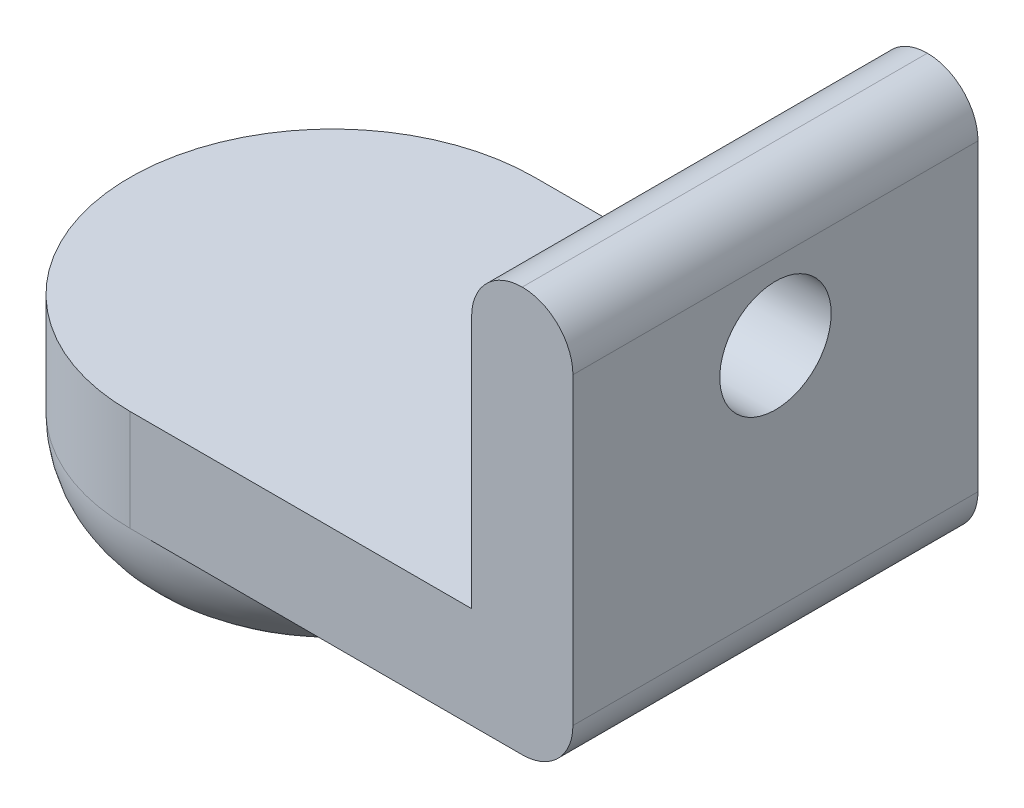
ISO-10303-21;
HEADER;
FILE_DESCRIPTION(('STEP AP214'),'2;1');
FILE_NAME('part.step','',(''),(''),'','','');
FILE_SCHEMA(('AUTOMOTIVE_DESIGN { 1 0 10303 214 1 1 1 1 }'));
ENDSEC;
DATA;
#1=APPLICATION_CONTEXT('core data for automotive mechanical design processes');
#2=APPLICATION_PROTOCOL_DEFINITION('international standard','automotive_design',2000,#1);
#3=PRODUCT_CONTEXT('',#1,'mechanical');
#4=PRODUCT('Part','Part','',(#3));
#5=PRODUCT_RELATED_PRODUCT_CATEGORY('part','',(#4));
#6=PRODUCT_DEFINITION_FORMATION('','',#4);
#7=PRODUCT_DEFINITION_CONTEXT('part definition',#1,'design');
#8=PRODUCT_DEFINITION('design','',#6,#7);
#9=PRODUCT_DEFINITION_SHAPE('','',#8);
#10=(LENGTH_UNIT() NAMED_UNIT(*) SI_UNIT(.MILLI.,.METRE.));
#11=(NAMED_UNIT(*) PLANE_ANGLE_UNIT() SI_UNIT($,.RADIAN.));
#12=(NAMED_UNIT(*) SI_UNIT($,.STERADIAN.) SOLID_ANGLE_UNIT());
#13=UNCERTAINTY_MEASURE_WITH_UNIT(LENGTH_MEASURE(1.E-05),#10,'distance_accuracy_value','');
#14=(GEOMETRIC_REPRESENTATION_CONTEXT(3) GLOBAL_UNCERTAINTY_ASSIGNED_CONTEXT((#13)) GLOBAL_UNIT_ASSIGNED_CONTEXT((#10,
#11,#12)) REPRESENTATION_CONTEXT('',''));
#15=CARTESIAN_POINT('',(0.,0.,0.));
#16=DIRECTION('',(0.,0.,1.));
#17=DIRECTION('',(1.,0.,0.));
#18=AXIS2_PLACEMENT_3D('',#15,#16,#17);
#19=CARTESIAN_POINT('',(0.,2.,0.));
#20=DIRECTION('',(0.,1.,0.));
#21=DIRECTION('',(0.,0.,1.));
#22=AXIS2_PLACEMENT_3D('',#19,#20,#21);
#23=PLANE('',#22);
#24=DIRECTION('',(0.,0.,1.));
#25=VECTOR('',#24,1.);
#26=CARTESIAN_POINT('',(6.74999999999999,2.,-4.));
#27=LINE('',#26,#25);
#28=CARTESIAN_POINT('',(6.74999999999999,2.,-4.));
#29=VERTEX_POINT('',#28);
#30=CARTESIAN_POINT('',(6.74999999999999,2.,4.));
#31=VERTEX_POINT('',#30);
#32=EDGE_CURVE('E110',#29,#31,#27,.T.);
#33=ORIENTED_EDGE('',*,*,#32,.F.);
#34=DIRECTION('',(-1.,0.,0.));
#35=VECTOR('',#34,1.);
#36=CARTESIAN_POINT('',(0.,2.,-4.));
#37=LINE('',#36,#35);
#38=CARTESIAN_POINT('',(0.,2.,-4.));
#39=VERTEX_POINT('',#38);
#40=EDGE_CURVE('E118',#29,#39,#37,.T.);
#41=ORIENTED_EDGE('',*,*,#40,.T.);
#42=CARTESIAN_POINT('',(0.,2.,0.));
#43=DIRECTION('',(0.,1.,0.));
#44=DIRECTION('',(0.,0.,1.));
#45=AXIS2_PLACEMENT_3D('',#42,#43,#44);
#46=CIRCLE('',#45,4.);
#47=CARTESIAN_POINT('',(0.,2.,4.));
#48=VERTEX_POINT('',#47);
#49=EDGE_CURVE('E116',#39,#48,#46,.T.);
#50=ORIENTED_EDGE('',*,*,#49,.T.);
#51=DIRECTION('',(1.,0.,0.));
#52=VECTOR('',#51,1.);
#53=CARTESIAN_POINT('',(0.,2.,4.));
#54=LINE('',#53,#52);
#55=EDGE_CURVE('E101',#48,#31,#54,.T.);
#56=ORIENTED_EDGE('',*,*,#55,.T.);
#57=EDGE_LOOP('',(#33,#41,#50,#56));
#58=FACE_BOUND('',#57,.T.);
#59=ADVANCED_FACE('F34',(#58),#23,.T.);
#60=CARTESIAN_POINT('',(0.,0.,0.));
#61=DIRECTION('',(0.,1.,0.));
#62=DIRECTION('',(0.,0.,1.));
#63=AXIS2_PLACEMENT_3D('',#60,#61,#62);
#64=PLANE('',#63);
#65=DIRECTION('',(-1.,0.,0.));
#66=VECTOR('',#65,1.);
#67=CARTESIAN_POINT('',(0.,0.,-4.));
#68=LINE('',#67,#66);
#69=CARTESIAN_POINT('',(7.74999999999999,0.,-4.));
#70=VERTEX_POINT('',#69);
#71=CARTESIAN_POINT('',(0.,0.,-4.));
#72=VERTEX_POINT('',#71);
#73=EDGE_CURVE('E136',#70,#72,#68,.T.);
#74=ORIENTED_EDGE('',*,*,#73,.F.);
#75=DIRECTION('',(0.,0.,-1.));
#76=VECTOR('',#75,1.);
#77=CARTESIAN_POINT('',(7.74999999999999,0.,4.));
#78=LINE('',#77,#76);
#79=CARTESIAN_POINT('',(7.74999999999999,0.,4.));
#80=VERTEX_POINT('',#79);
#81=EDGE_CURVE('E157',#70,#80,#78,.F.);
#82=ORIENTED_EDGE('',*,*,#81,.T.);
#83=DIRECTION('',(1.,0.,0.));
#84=VECTOR('',#83,1.);
#85=CARTESIAN_POINT('',(0.,0.,4.));
#86=LINE('',#85,#84);
#87=CARTESIAN_POINT('',(0.,0.,4.));
#88=VERTEX_POINT('',#87);
#89=EDGE_CURVE('E135',#88,#80,#86,.T.);
#90=ORIENTED_EDGE('',*,*,#89,.F.);
#91=CARTESIAN_POINT('',(0.,0.,0.));
#92=DIRECTION('',(0.,1.,0.));
#93=DIRECTION('',(0.,0.,1.));
#94=AXIS2_PLACEMENT_3D('',#91,#92,#93);
#95=CIRCLE('',#94,4.);
#96=EDGE_CURVE('E132',#88,#72,#95,.T.);
#97=ORIENTED_EDGE('',*,*,#96,.T.);
#98=EDGE_LOOP('',(#74,#82,#90,#97));
#99=FACE_BOUND('',#98,.T.);
#100=ADVANCED_FACE('F181',(#99),#64,.F.);
#101=CARTESIAN_POINT('',(0.,2.,4.));
#102=DIRECTION('',(0.,0.,-1.));
#103=DIRECTION('',(-1.,0.,0.));
#104=AXIS2_PLACEMENT_3D('',#101,#102,#103);
#105=PLANE('',#104);
#106=CARTESIAN_POINT('',(7.74999999999999,7.,4.));
#107=DIRECTION('',(0.,0.,-1.));
#108=DIRECTION('',(-1.,0.,0.));
#109=AXIS2_PLACEMENT_3D('',#106,#107,#108);
#110=CIRCLE('',#109,1.);
#111=CARTESIAN_POINT('',(8.74999999999999,7.,4.));
#112=VERTEX_POINT('',#111);
#113=CARTESIAN_POINT('',(7.74999999999999,8.,4.));
#114=VERTEX_POINT('',#113);
#115=EDGE_CURVE('E162',#112,#114,#110,.F.);
#116=ORIENTED_EDGE('',*,*,#115,.T.);
#117=CARTESIAN_POINT('',(7.74999999999999,7.,4.));
#118=DIRECTION('',(0.,0.,-1.));
#119=DIRECTION('',(-1.,0.,0.));
#120=AXIS2_PLACEMENT_3D('',#117,#118,#119);
#121=CIRCLE('',#120,1.);
#122=CARTESIAN_POINT('',(6.74999999999999,7.,4.));
#123=VERTEX_POINT('',#122);
#124=EDGE_CURVE('E104',#114,#123,#121,.F.);
#125=ORIENTED_EDGE('',*,*,#124,.T.);
#126=DIRECTION('',(0.,-1.,0.));
#127=VECTOR('',#126,1.);
#128=CARTESIAN_POINT('',(6.74999999999999,8.,4.));
#129=LINE('',#128,#127);
#130=EDGE_CURVE('E97',#123,#31,#129,.T.);
#131=ORIENTED_EDGE('',*,*,#130,.T.);
#132=ORIENTED_EDGE('',*,*,#55,.F.);
#133=DIRECTION('',(0.,-1.,0.));
#134=VECTOR('',#133,1.);
#135=CARTESIAN_POINT('',(0.,2.,4.));
#136=LINE('',#135,#134);
#137=EDGE_CURVE('E145',#48,#88,#136,.T.);
#138=ORIENTED_EDGE('',*,*,#137,.T.);
#139=ORIENTED_EDGE('',*,*,#89,.T.);
#140=CARTESIAN_POINT('',(7.74999999999999,1.,4.));
#141=DIRECTION('',(0.,0.,-1.));
#142=DIRECTION('',(-1.,0.,0.));
#143=AXIS2_PLACEMENT_3D('',#140,#141,#142);
#144=CIRCLE('',#143,1.);
#145=CARTESIAN_POINT('',(8.74999999999999,1.,4.));
#146=VERTEX_POINT('',#145);
#147=EDGE_CURVE('E159',#80,#146,#144,.F.);
#148=ORIENTED_EDGE('',*,*,#147,.T.);
#149=DIRECTION('',(0.,-1.,0.));
#150=VECTOR('',#149,1.);
#151=CARTESIAN_POINT('',(8.74999999999999,5.5,4.));
#152=LINE('',#151,#150);
#153=EDGE_CURVE('E128',#112,#146,#152,.T.);
#154=ORIENTED_EDGE('',*,*,#153,.F.);
#155=EDGE_LOOP('',(#116,#125,#131,#132,#138,#139,#148,#154));
#156=FACE_BOUND('',#155,.T.);
#157=ADVANCED_FACE('F99',(#156),#105,.F.);
#158=CARTESIAN_POINT('',(0.,2.,-4.));
#159=DIRECTION('',(0.,0.,1.));
#160=DIRECTION('',(1.,0.,0.));
#161=AXIS2_PLACEMENT_3D('',#158,#159,#160);
#162=PLANE('',#161);
#163=DIRECTION('',(0.,-1.,0.));
#164=VECTOR('',#163,1.);
#165=CARTESIAN_POINT('',(6.74999999999999,8.,-4.));
#166=LINE('',#165,#164);
#167=CARTESIAN_POINT('',(6.74999999999999,7.,-4.));
#168=VERTEX_POINT('',#167);
#169=EDGE_CURVE('E109',#168,#29,#166,.T.);
#170=ORIENTED_EDGE('',*,*,#169,.F.);
#171=CARTESIAN_POINT('',(7.74999999999999,7.,-4.));
#172=DIRECTION('',(0.,0.,1.));
#173=DIRECTION('',(1.,0.,0.));
#174=AXIS2_PLACEMENT_3D('',#171,#172,#173);
#175=CIRCLE('',#174,1.);
#176=CARTESIAN_POINT('',(7.74999999999999,8.,-4.));
#177=VERTEX_POINT('',#176);
#178=EDGE_CURVE('E43',#168,#177,#175,.F.);
#179=ORIENTED_EDGE('',*,*,#178,.T.);
#180=CARTESIAN_POINT('',(7.74999999999999,7.,-4.));
#181=DIRECTION('',(0.,0.,1.));
#182=DIRECTION('',(1.,0.,0.));
#183=AXIS2_PLACEMENT_3D('',#180,#181,#182);
#184=CIRCLE('',#183,1.);
#185=CARTESIAN_POINT('',(8.74999999999999,7.,-4.));
#186=VERTEX_POINT('',#185);
#187=EDGE_CURVE('E54',#177,#186,#184,.F.);
#188=ORIENTED_EDGE('',*,*,#187,.T.);
#189=DIRECTION('',(0.,1.,0.));
#190=VECTOR('',#189,1.);
#191=CARTESIAN_POINT('',(8.74999999999999,0.,-4.));
#192=LINE('',#191,#190);
#193=CARTESIAN_POINT('',(8.74999999999999,1.,-4.));
#194=VERTEX_POINT('',#193);
#195=EDGE_CURVE('E130',#194,#186,#192,.T.);
#196=ORIENTED_EDGE('',*,*,#195,.F.);
#197=CARTESIAN_POINT('',(7.74999999999999,1.,-4.));
#198=DIRECTION('',(0.,0.,1.));
#199=DIRECTION('',(1.,0.,0.));
#200=AXIS2_PLACEMENT_3D('',#197,#198,#199);
#201=CIRCLE('',#200,1.);
#202=EDGE_CURVE('E155',#194,#70,#201,.F.);
#203=ORIENTED_EDGE('',*,*,#202,.T.);
#204=ORIENTED_EDGE('',*,*,#73,.T.);
#205=DIRECTION('',(0.,-1.,0.));
#206=VECTOR('',#205,1.);
#207=CARTESIAN_POINT('',(0.,2.,-4.));
#208=LINE('',#207,#206);
#209=EDGE_CURVE('E139',#39,#72,#208,.T.);
#210=ORIENTED_EDGE('',*,*,#209,.F.);
#211=ORIENTED_EDGE('',*,*,#40,.F.);
#212=EDGE_LOOP('',(#170,#179,#188,#196,#203,#204,#210,#211));
#213=FACE_BOUND('',#212,.T.);
#214=ADVANCED_FACE('F169',(#213),#162,.F.);
#215=CARTESIAN_POINT('',(0.,2.,0.));
#216=DIRECTION('',(0.,-1.,0.));
#217=DIRECTION('',(0.,0.,-1.));
#218=AXIS2_PLACEMENT_3D('',#215,#216,#217);
#219=CYLINDRICAL_SURFACE('',#218,4.);
#220=ORIENTED_EDGE('',*,*,#209,.T.);
#221=CARTESIAN_POINT('',(0.,0.,0.));
#222=DIRECTION('',(0.,1.,0.));
#223=DIRECTION('',(0.,0.,1.));
#224=AXIS2_PLACEMENT_3D('',#221,#222,#223);
#225=CIRCLE('',#224,4.);
#226=EDGE_CURVE('E147',#72,#88,#225,.T.);
#227=ORIENTED_EDGE('',*,*,#226,.T.);
#228=ORIENTED_EDGE('',*,*,#137,.F.);
#229=ORIENTED_EDGE('',*,*,#49,.F.);
#230=EDGE_LOOP('',(#220,#227,#228,#229));
#231=FACE_BOUND('',#230,.T.);
#232=ADVANCED_FACE('F174',(#231),#219,.T.);
#233=CARTESIAN_POINT('',(0.,-2.,0.));
#234=DIRECTION('',(0.,1.,0.));
#235=DIRECTION('',(0.,0.,1.));
#236=AXIS2_PLACEMENT_3D('',#233,#234,#235);
#237=PLANE('',#236);
#238=CARTESIAN_POINT('',(0.,-2.,0.));
#239=DIRECTION('',(0.,1.,0.));
#240=DIRECTION('',(0.,0.,1.));
#241=AXIS2_PLACEMENT_3D('',#238,#239,#240);
#242=CIRCLE('',#241,2.);
#243=CARTESIAN_POINT('',(0.,-2.,2.));
#244=VERTEX_POINT('',#243);
#245=EDGE_CURVE('E149',#244,#244,#242,.F.);
#246=ORIENTED_EDGE('',*,*,#245,.T.);
#247=EDGE_LOOP('',(#246));
#248=FACE_BOUND('',#247,.T.);
#249=ADVANCED_FACE('F209',(#248),#237,.F.);
#250=CARTESIAN_POINT('',(0.,0.,0.));
#251=DIRECTION('',(0.,1.,0.));
#252=DIRECTION('',(0.,0.,1.));
#253=AXIS2_PLACEMENT_3D('',#250,#251,#252);
#254=DEGENERATE_TOROIDAL_SURFACE('',#253,2.,2.,.T.);
#255=ORIENTED_EDGE('',*,*,#245,.F.);
#256=EDGE_LOOP('',(#255));
#257=FACE_BOUND('',#256,.T.);
#258=ORIENTED_EDGE('',*,*,#226,.F.);
#259=ORIENTED_EDGE('',*,*,#96,.F.);
#260=EDGE_LOOP('',(#258,#259));
#261=FACE_BOUND('',#260,.T.);
#262=ADVANCED_FACE('F179',(#257,#261),#254,.T.);
#263=CARTESIAN_POINT('',(8.74999999999999,0.,0.));
#264=DIRECTION('',(1.,0.,0.));
#265=DIRECTION('',(0.,0.,-1.));
#266=AXIS2_PLACEMENT_3D('',#263,#264,#265);
#267=PLANE('',#266);
#268=CARTESIAN_POINT('',(8.74999999999999,5.5,0.));
#269=DIRECTION('',(1.,0.,0.));
#270=DIRECTION('',(0.,0.,-1.));
#271=AXIS2_PLACEMENT_3D('',#268,#269,#270);
#272=CIRCLE('',#271,1.1);
#273=CARTESIAN_POINT('',(8.74999999999999,5.5,-1.1));
#274=VERTEX_POINT('',#273);
#275=EDGE_CURVE('E125',#274,#274,#272,.T.);
#276=ORIENTED_EDGE('',*,*,#275,.F.);
#277=EDGE_LOOP('',(#276));
#278=FACE_BOUND('',#277,.T.);
#279=ORIENTED_EDGE('',*,*,#195,.T.);
#280=DIRECTION('',(0.,0.,-1.));
#281=VECTOR('',#280,1.);
#282=CARTESIAN_POINT('',(8.74999999999999,7.,0.));
#283=LINE('',#282,#281);
#284=EDGE_CURVE('E11',#186,#112,#283,.F.);
#285=ORIENTED_EDGE('',*,*,#284,.T.);
#286=ORIENTED_EDGE('',*,*,#153,.T.);
#287=DIRECTION('',(0.,0.,-1.));
#288=VECTOR('',#287,1.);
#289=CARTESIAN_POINT('',(8.74999999999999,1.,-4.));
#290=LINE('',#289,#288);
#291=EDGE_CURVE('E152',#146,#194,#290,.T.);
#292=ORIENTED_EDGE('',*,*,#291,.T.);
#293=EDGE_LOOP('',(#279,#285,#286,#292));
#294=FACE_BOUND('',#293,.T.);
#295=ADVANCED_FACE('F219',(#278,#294),#267,.T.);
#296=CARTESIAN_POINT('',(6.74999999999999,8.,-4.));
#297=DIRECTION('',(1.,0.,0.));
#298=DIRECTION('',(0.,0.,-1.));
#299=AXIS2_PLACEMENT_3D('',#296,#297,#298);
#300=PLANE('',#299);
#301=CARTESIAN_POINT('',(6.74999999999999,5.5,0.));
#302=DIRECTION('',(1.,0.,0.));
#303=DIRECTION('',(0.,0.,-1.));
#304=AXIS2_PLACEMENT_3D('',#301,#302,#303);
#305=CIRCLE('',#304,1.1);
#306=CARTESIAN_POINT('',(6.74999999999999,5.5,-1.1));
#307=VERTEX_POINT('',#306);
#308=EDGE_CURVE('E38',#307,#307,#305,.T.);
#309=ORIENTED_EDGE('',*,*,#308,.T.);
#310=EDGE_LOOP('',(#309));
#311=FACE_BOUND('',#310,.T.);
#312=ORIENTED_EDGE('',*,*,#130,.F.);
#313=DIRECTION('',(0.,0.,1.));
#314=VECTOR('',#313,1.);
#315=CARTESIAN_POINT('',(6.74999999999999,7.,-4.));
#316=LINE('',#315,#314);
#317=EDGE_CURVE('E165',#123,#168,#316,.F.);
#318=ORIENTED_EDGE('',*,*,#317,.T.);
#319=ORIENTED_EDGE('',*,*,#169,.T.);
#320=ORIENTED_EDGE('',*,*,#32,.T.);
#321=EDGE_LOOP('',(#312,#318,#319,#320));
#322=FACE_BOUND('',#321,.T.);
#323=ADVANCED_FACE('F120',(#311,#322),#300,.F.);
#324=CARTESIAN_POINT('',(7.74999999999999,1.,0.));
#325=DIRECTION('',(0.,0.,1.));
#326=DIRECTION('',(1.,0.,0.));
#327=AXIS2_PLACEMENT_3D('',#324,#325,#326);
#328=CYLINDRICAL_SURFACE('',#327,1.);
#329=ORIENTED_EDGE('',*,*,#147,.F.);
#330=ORIENTED_EDGE('',*,*,#81,.F.);
#331=ORIENTED_EDGE('',*,*,#202,.F.);
#332=ORIENTED_EDGE('',*,*,#291,.F.);
#333=EDGE_LOOP('',(#329,#330,#331,#332));
#334=FACE_BOUND('',#333,.T.);
#335=ADVANCED_FACE('F184',(#334),#328,.T.);
#336=CARTESIAN_POINT('',(7.74999999999999,7.,0.));
#337=DIRECTION('',(0.,0.,-1.));
#338=DIRECTION('',(-1.,0.,0.));
#339=AXIS2_PLACEMENT_3D('',#336,#337,#338);
#340=CYLINDRICAL_SURFACE('',#339,1.);
#341=ORIENTED_EDGE('',*,*,#284,.F.);
#342=ORIENTED_EDGE('',*,*,#187,.F.);
#343=DIRECTION('',(0.,0.,-1.));
#344=VECTOR('',#343,1.);
#345=CARTESIAN_POINT('',(7.74999999999999,8.,0.));
#346=LINE('',#345,#344);
#347=EDGE_CURVE('E121',#114,#177,#346,.T.);
#348=ORIENTED_EDGE('',*,*,#347,.F.);
#349=ORIENTED_EDGE('',*,*,#115,.F.);
#350=EDGE_LOOP('',(#341,#342,#348,#349));
#351=FACE_BOUND('',#350,.T.);
#352=ADVANCED_FACE('F36',(#351),#340,.T.);
#353=CARTESIAN_POINT('',(7.74999999999999,7.,0.));
#354=DIRECTION('',(0.,0.,-1.));
#355=DIRECTION('',(-1.,0.,0.));
#356=AXIS2_PLACEMENT_3D('',#353,#354,#355);
#357=CYLINDRICAL_SURFACE('',#356,1.);
#358=ORIENTED_EDGE('',*,*,#178,.F.);
#359=ORIENTED_EDGE('',*,*,#317,.F.);
#360=ORIENTED_EDGE('',*,*,#124,.F.);
#361=ORIENTED_EDGE('',*,*,#347,.T.);
#362=EDGE_LOOP('',(#358,#359,#360,#361));
#363=FACE_BOUND('',#362,.T.);
#364=ADVANCED_FACE('F192',(#363),#357,.T.);
#365=CARTESIAN_POINT('',(-1.25000000000001,5.5,0.));
#366=DIRECTION('',(1.,0.,0.));
#367=DIRECTION('',(0.,0.,-1.));
#368=AXIS2_PLACEMENT_3D('',#365,#366,#367);
#369=CYLINDRICAL_SURFACE('',#368,1.1);
#370=ORIENTED_EDGE('',*,*,#275,.T.);
#371=EDGE_LOOP('',(#370));
#372=FACE_BOUND('',#371,.T.);
#373=ORIENTED_EDGE('',*,*,#308,.F.);
#374=EDGE_LOOP('',(#373));
#375=FACE_BOUND('',#374,.T.);
#376=ADVANCED_FACE('F194',(#372,#375),#369,.F.);
#377=CLOSED_SHELL('',(#59,#100,#157,#214,#232,#249,#262,#295,#323,#335,#352,#364,#376));
#378=MANIFOLD_SOLID_BREP('B2',#377);
#379=ADVANCED_BREP_SHAPE_REPRESENTATION('',(#18,#378),#14);
#380=SHAPE_DEFINITION_REPRESENTATION(#9,#379);
ENDSEC;
END-ISO-10303-21;
